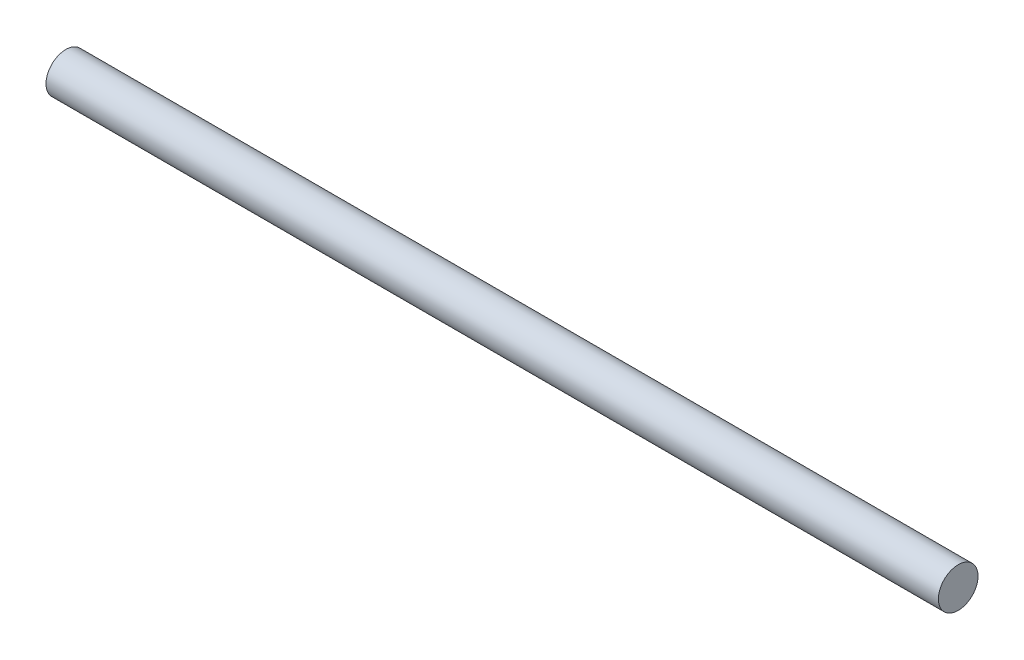
ISO-10303-21;
HEADER;
FILE_DESCRIPTION(('STEP AP214'),'2;1');
FILE_NAME('part.step','',(''),(''),'','','');
FILE_SCHEMA(('AUTOMOTIVE_DESIGN { 1 0 10303 214 1 1 1 1 }'));
ENDSEC;
DATA;
#1=APPLICATION_CONTEXT('core data for automotive mechanical design processes');
#2=APPLICATION_PROTOCOL_DEFINITION('international standard','automotive_design',2000,#1);
#3=PRODUCT_CONTEXT('',#1,'mechanical');
#4=PRODUCT('Part','Part','',(#3));
#5=PRODUCT_RELATED_PRODUCT_CATEGORY('part','',(#4));
#6=PRODUCT_DEFINITION_FORMATION('','',#4);
#7=PRODUCT_DEFINITION_CONTEXT('part definition',#1,'design');
#8=PRODUCT_DEFINITION('design','',#6,#7);
#9=PRODUCT_DEFINITION_SHAPE('','',#8);
#10=(LENGTH_UNIT() NAMED_UNIT(*) SI_UNIT(.MILLI.,.METRE.));
#11=(NAMED_UNIT(*) PLANE_ANGLE_UNIT() SI_UNIT($,.RADIAN.));
#12=(NAMED_UNIT(*) SI_UNIT($,.STERADIAN.) SOLID_ANGLE_UNIT());
#13=UNCERTAINTY_MEASURE_WITH_UNIT(LENGTH_MEASURE(1.E-05),#10,'distance_accuracy_value','');
#14=(GEOMETRIC_REPRESENTATION_CONTEXT(3) GLOBAL_UNCERTAINTY_ASSIGNED_CONTEXT((#13)) GLOBAL_UNIT_ASSIGNED_CONTEXT((#10,
#11,#12)) REPRESENTATION_CONTEXT('',''));
#15=CARTESIAN_POINT('',(0.,0.,0.));
#16=DIRECTION('',(0.,0.,1.));
#17=DIRECTION('',(1.,0.,0.));
#18=AXIS2_PLACEMENT_3D('',#15,#16,#17);
#19=CARTESIAN_POINT('',(45.,0.,0.));
#20=DIRECTION('',(-1.,0.,0.));
#21=DIRECTION('',(0.,0.,1.));
#22=AXIS2_PLACEMENT_3D('',#19,#20,#21);
#23=CYLINDRICAL_SURFACE('',#22,1.);
#24=CARTESIAN_POINT('',(45.,0.,0.));
#25=DIRECTION('',(1.,0.,0.));
#26=DIRECTION('',(0.,0.,-1.));
#27=AXIS2_PLACEMENT_3D('',#24,#25,#26);
#28=CIRCLE('',#27,1.);
#29=CARTESIAN_POINT('',(45.,0.,1.));
#30=VERTEX_POINT('',#29);
#31=EDGE_CURVE('E10',#30,#30,#28,.T.);
#32=CARTESIAN_POINT('',(0.,0.,0.));
#33=DIRECTION('',(1.,0.,0.));
#34=DIRECTION('',(0.,0.,-1.));
#35=AXIS2_PLACEMENT_3D('',#32,#33,#34);
#36=CIRCLE('',#35,1.);
#37=CARTESIAN_POINT('',(0.,0.,1.));
#38=VERTEX_POINT('',#37);
#39=EDGE_CURVE('E34',#38,#38,#36,.T.);
#40=CARTESIAN_POINT('',(45.,0.,1.));
#41=CARTESIAN_POINT('',(44.53125,0.,1.));
#42=CARTESIAN_POINT('',(44.0625,0.,1.));
#43=CARTESIAN_POINT('',(43.125,0.,1.));
#44=CARTESIAN_POINT('',(42.65625,0.,1.));
#45=CARTESIAN_POINT('',(41.71875,0.,1.));
#46=CARTESIAN_POINT('',(41.25,0.,1.));
#47=CARTESIAN_POINT('',(40.3125,0.,1.));
#48=CARTESIAN_POINT('',(39.84375,0.,1.));
#49=CARTESIAN_POINT('',(38.90625,0.,1.));
#50=CARTESIAN_POINT('',(38.4375,0.,1.));
#51=CARTESIAN_POINT('',(37.5,0.,1.));
#52=CARTESIAN_POINT('',(37.03125,0.,1.));
#53=CARTESIAN_POINT('',(36.09375,0.,1.));
#54=CARTESIAN_POINT('',(35.625,0.,1.));
#55=CARTESIAN_POINT('',(34.6875,0.,1.));
#56=CARTESIAN_POINT('',(34.21875,0.,1.));
#57=CARTESIAN_POINT('',(33.28125,0.,1.));
#58=CARTESIAN_POINT('',(32.8125,0.,1.));
#59=CARTESIAN_POINT('',(31.875,0.,1.));
#60=CARTESIAN_POINT('',(31.40625,0.,1.));
#61=CARTESIAN_POINT('',(30.46875,0.,1.));
#62=CARTESIAN_POINT('',(30.,0.,1.));
#63=CARTESIAN_POINT('',(29.0625,0.,1.));
#64=CARTESIAN_POINT('',(28.59375,0.,1.));
#65=CARTESIAN_POINT('',(27.65625,0.,1.));
#66=CARTESIAN_POINT('',(27.1875,0.,1.));
#67=CARTESIAN_POINT('',(26.25,0.,1.));
#68=CARTESIAN_POINT('',(25.78125,0.,1.));
#69=CARTESIAN_POINT('',(24.84375,0.,1.));
#70=CARTESIAN_POINT('',(24.375,0.,1.));
#71=CARTESIAN_POINT('',(23.4375,0.,1.));
#72=CARTESIAN_POINT('',(22.96875,0.,1.));
#73=CARTESIAN_POINT('',(22.03125,0.,1.));
#74=CARTESIAN_POINT('',(21.5625,0.,1.));
#75=CARTESIAN_POINT('',(20.625,0.,1.));
#76=CARTESIAN_POINT('',(20.15625,0.,1.));
#77=CARTESIAN_POINT('',(19.21875,0.,1.));
#78=CARTESIAN_POINT('',(18.75,0.,1.));
#79=CARTESIAN_POINT('',(17.8125,0.,1.));
#80=CARTESIAN_POINT('',(17.34375,0.,1.));
#81=CARTESIAN_POINT('',(16.40625,0.,1.));
#82=CARTESIAN_POINT('',(15.9375,0.,1.));
#83=CARTESIAN_POINT('',(15.,0.,1.));
#84=CARTESIAN_POINT('',(14.53125,0.,1.));
#85=CARTESIAN_POINT('',(13.59375,0.,1.));
#86=CARTESIAN_POINT('',(13.125,0.,1.));
#87=CARTESIAN_POINT('',(12.1875,0.,1.));
#88=CARTESIAN_POINT('',(11.71875,0.,1.));
#89=CARTESIAN_POINT('',(10.78125,0.,1.));
#90=CARTESIAN_POINT('',(10.3125,0.,1.));
#91=CARTESIAN_POINT('',(9.37499999999999,0.,1.));
#92=CARTESIAN_POINT('',(8.90624999999999,0.,1.));
#93=CARTESIAN_POINT('',(7.96874999999999,0.,1.));
#94=CARTESIAN_POINT('',(7.5,0.,1.));
#95=CARTESIAN_POINT('',(6.56249999999999,0.,1.));
#96=CARTESIAN_POINT('',(6.09374999999999,0.,1.));
#97=CARTESIAN_POINT('',(5.15624999999999,0.,1.));
#98=CARTESIAN_POINT('',(4.68749999999999,0.,1.));
#99=CARTESIAN_POINT('',(3.74999999999999,0.,1.));
#100=CARTESIAN_POINT('',(3.28124999999999,0.,1.));
#101=CARTESIAN_POINT('',(2.34374999999999,0.,1.));
#102=CARTESIAN_POINT('',(1.87499999999999,0.,1.));
#103=CARTESIAN_POINT('',(0.937499999999992,0.,1.));
#104=CARTESIAN_POINT('',(0.468749999999993,0.,1.));
#105=CARTESIAN_POINT('',(0.,0.,1.));
#106=B_SPLINE_CURVE_WITH_KNOTS('',3,(#40,#41,#42,#43,#44,#45,#46,#47,#48,#49,#50,#51,#52,#53,
#54,#55,#56,#57,#58,#59,#60,#61,#62,#63,#64,#65,#66,#67,#68,#69,#70,#71,#72,#73,#74,#75,#76,#77,
#78,#79,#80,#81,#82,#83,#84,#85,#86,#87,#88,#89,#90,#91,#92,#93,#94,#95,#96,#97,#98,#99,#100,
#101,#102,#103,#104,#105),.UNSPECIFIED.,.F.,.F.,(4,2,2,2,2,2,2,2,2,2,2,2,2,2,2,2,2,2,2,2,2,2,2,
2,2,2,2,2,2,2,2,2,4),(0.,1.40625,2.8125,4.21874999999999,5.625,7.03125,8.43749999999999,9.84375,
11.25,12.65625,14.0625,15.46875,16.875,18.28125,19.6875,21.09375,22.5,23.90625,25.3125,26.71875,
28.125,29.53125,30.9375,32.34375,33.75,35.15625,36.5625,37.96875,39.375,40.78125,42.1875,
43.59375,45.),.UNSPECIFIED.);
#107=EDGE_CURVE('BSEAM31',#30,#38,#106,.T.);
#108=ORIENTED_EDGE('',*,*,#31,.F.);
#109=ORIENTED_EDGE('',*,*,#39,.T.);
#110=ORIENTED_EDGE('',*,*,#107,.T.);
#111=ORIENTED_EDGE('',*,*,#107,.F.);
#112=EDGE_LOOP('',(#108,#110,#109,#111));
#113=FACE_BOUND('',#112,.T.);
#114=ADVANCED_FACE('F31',(#113),#23,.T.);
#115=CARTESIAN_POINT('',(45.,0.,0.));
#116=DIRECTION('',(1.,0.,0.));
#117=DIRECTION('',(0.,0.,-1.));
#118=AXIS2_PLACEMENT_3D('',#115,#116,#117);
#119=PLANE('',#118);
#120=ORIENTED_EDGE('',*,*,#31,.T.);
#121=EDGE_LOOP('',(#120));
#122=FACE_BOUND('',#121,.T.);
#123=ADVANCED_FACE('F46',(#122),#119,.T.);
#124=CARTESIAN_POINT('',(0.,0.,0.));
#125=DIRECTION('',(1.,0.,0.));
#126=DIRECTION('',(0.,0.,-1.));
#127=AXIS2_PLACEMENT_3D('',#124,#125,#126);
#128=PLANE('',#127);
#129=ORIENTED_EDGE('',*,*,#39,.F.);
#130=EDGE_LOOP('',(#129));
#131=FACE_BOUND('',#130,.T.);
#132=ADVANCED_FACE('F44',(#131),#128,.F.);
#133=CLOSED_SHELL('',(#114,#123,#132));
#134=MANIFOLD_SOLID_BREP('B2',#133);
#135=ADVANCED_BREP_SHAPE_REPRESENTATION('',(#18,#134),#14);
#136=SHAPE_DEFINITION_REPRESENTATION(#9,#135);
ENDSEC;
END-ISO-10303-21;
